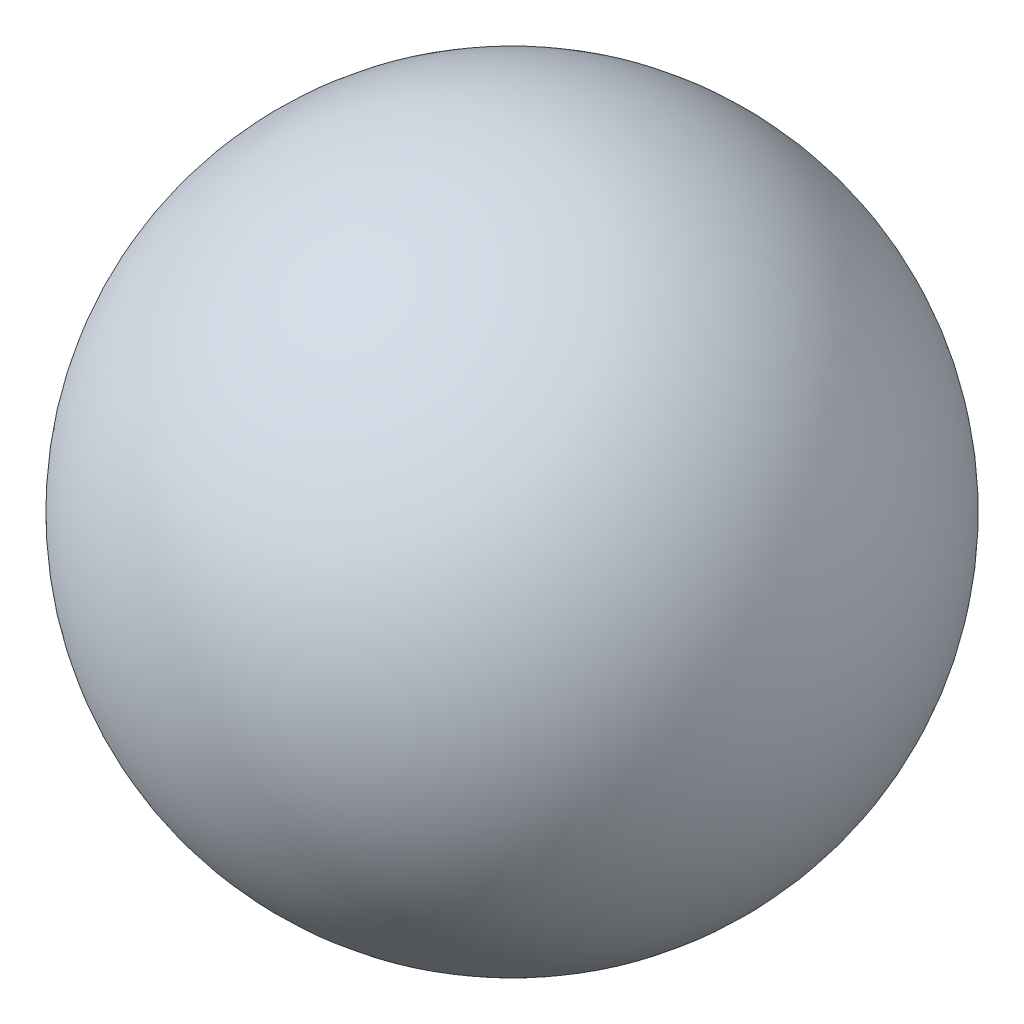
ISO-10303-21;
HEADER;
FILE_DESCRIPTION(('STEP AP214'),'2;1');
FILE_NAME('part.step','',(''),(''),'','','');
FILE_SCHEMA(('AUTOMOTIVE_DESIGN { 1 0 10303 214 1 1 1 1 }'));
ENDSEC;
DATA;
#1=APPLICATION_CONTEXT('core data for automotive mechanical design processes');
#2=APPLICATION_PROTOCOL_DEFINITION('international standard','automotive_design',2000,#1);
#3=PRODUCT_CONTEXT('',#1,'mechanical');
#4=PRODUCT('Part','Part','',(#3));
#5=PRODUCT_RELATED_PRODUCT_CATEGORY('part','',(#4));
#6=PRODUCT_DEFINITION_FORMATION('','',#4);
#7=PRODUCT_DEFINITION_CONTEXT('part definition',#1,'design');
#8=PRODUCT_DEFINITION('design','',#6,#7);
#9=PRODUCT_DEFINITION_SHAPE('','',#8);
#10=(LENGTH_UNIT() NAMED_UNIT(*) SI_UNIT(.MILLI.,.METRE.));
#11=(NAMED_UNIT(*) PLANE_ANGLE_UNIT() SI_UNIT($,.RADIAN.));
#12=(NAMED_UNIT(*) SI_UNIT($,.STERADIAN.) SOLID_ANGLE_UNIT());
#13=UNCERTAINTY_MEASURE_WITH_UNIT(LENGTH_MEASURE(1.E-05),#10,'distance_accuracy_value','');
#14=(GEOMETRIC_REPRESENTATION_CONTEXT(3) GLOBAL_UNCERTAINTY_ASSIGNED_CONTEXT((#13)) GLOBAL_UNIT_ASSIGNED_CONTEXT((#10,
#11,#12)) REPRESENTATION_CONTEXT('',''));
#15=CARTESIAN_POINT('',(0.,0.,0.));
#16=DIRECTION('',(0.,0.,1.));
#17=DIRECTION('',(1.,0.,0.));
#18=AXIS2_PLACEMENT_3D('',#15,#16,#17);
#19=CARTESIAN_POINT('',(0.,947.416921044107,0.));
#20=DIRECTION('',(0.,1.,0.));
#21=DIRECTION('',(1.,0.,0.));
#22=AXIS2_PLACEMENT_3D('',#19,#20,#21);
#23=SPHERICAL_SURFACE('',#22,4.);
#24=CARTESIAN_POINT('',(0.,951.416921044107,0.));
#25=VERTEX_POINT('',#24);
#26=VERTEX_LOOP('',#25);
#27=FACE_BOUND('',#26,.T.);
#28=ADVANCED_FACE('F36',(#27),#23,.T.);
#29=CLOSED_SHELL('',(#28));
#30=MANIFOLD_SOLID_BREP('B2',#29);
#31=ADVANCED_BREP_SHAPE_REPRESENTATION('',(#18,#30),#14);
#32=SHAPE_DEFINITION_REPRESENTATION(#9,#31);
ENDSEC;
END-ISO-10303-21;
